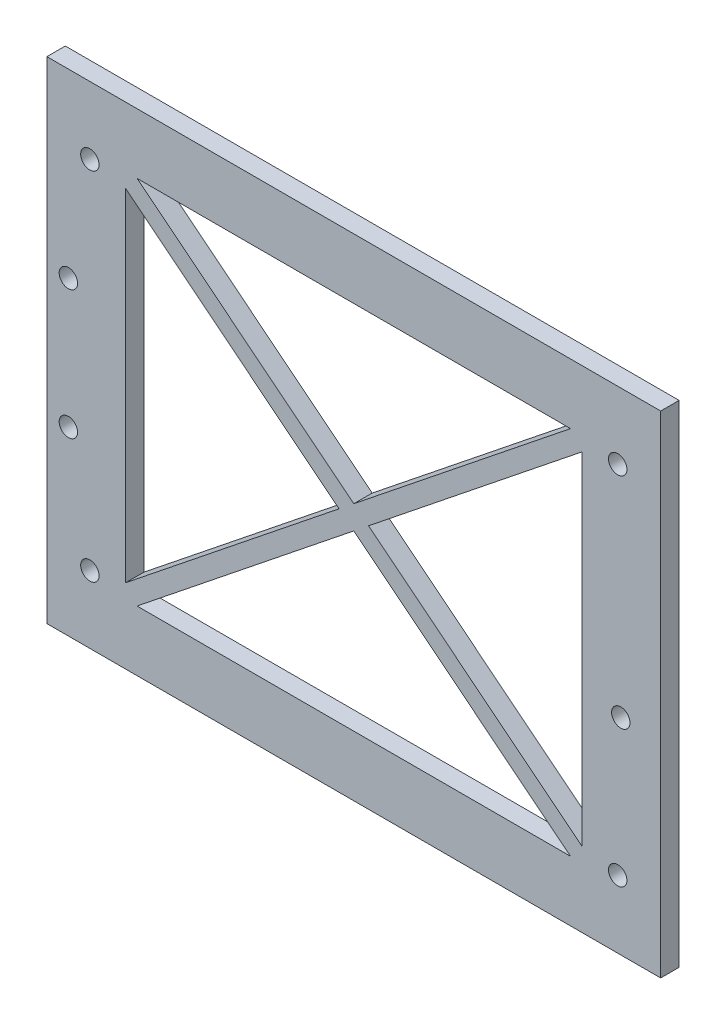
ISO-10303-21;
HEADER;
FILE_DESCRIPTION(('STEP AP214'),'2;1');
FILE_NAME('part.step','',(''),(''),'','','');
FILE_SCHEMA(('AUTOMOTIVE_DESIGN { 1 0 10303 214 1 1 1 1 }'));
ENDSEC;
DATA;
#1=APPLICATION_CONTEXT('core data for automotive mechanical design processes');
#2=APPLICATION_PROTOCOL_DEFINITION('international standard','automotive_design',2000,#1);
#3=PRODUCT_CONTEXT('',#1,'mechanical');
#4=PRODUCT('Part','Part','',(#3));
#5=PRODUCT_RELATED_PRODUCT_CATEGORY('part','',(#4));
#6=PRODUCT_DEFINITION_FORMATION('','',#4);
#7=PRODUCT_DEFINITION_CONTEXT('part definition',#1,'design');
#8=PRODUCT_DEFINITION('design','',#6,#7);
#9=PRODUCT_DEFINITION_SHAPE('','',#8);
#10=(LENGTH_UNIT() NAMED_UNIT(*) SI_UNIT(.MILLI.,.METRE.));
#11=(NAMED_UNIT(*) PLANE_ANGLE_UNIT() SI_UNIT($,.RADIAN.));
#12=(NAMED_UNIT(*) SI_UNIT($,.STERADIAN.) SOLID_ANGLE_UNIT());
#13=UNCERTAINTY_MEASURE_WITH_UNIT(LENGTH_MEASURE(1.E-05),#10,'distance_accuracy_value','');
#14=(GEOMETRIC_REPRESENTATION_CONTEXT(3) GLOBAL_UNCERTAINTY_ASSIGNED_CONTEXT((#13)) GLOBAL_UNIT_ASSIGNED_CONTEXT((#10,
#11,#12)) REPRESENTATION_CONTEXT('',''));
#15=CARTESIAN_POINT('',(0.,0.,0.));
#16=DIRECTION('',(0.,0.,1.));
#17=DIRECTION('',(1.,0.,0.));
#18=AXIS2_PLACEMENT_3D('',#15,#16,#17);
#19=CARTESIAN_POINT('',(2.4011715890373,0.,3.));
#20=DIRECTION('',(-0.624695047554424,0.78086880944303,0.));
#21=DIRECTION('',(-0.780868809443031,-0.624695047554424,0.));
#22=AXIS2_PLACEMENT_3D('',#19,#20,#21);
#23=PLANE('',#22);
#24=DIRECTION('',(0.780868809443031,0.624695047554424,0.));
#25=VECTOR('',#24,1.);
#26=CARTESIAN_POINT('',(2.4011715890373,0.,0.));
#27=LINE('',#26,#25);
#28=CARTESIAN_POINT('',(2.4011715890373,0.,0.));
#29=VERTEX_POINT('',#28);
#30=CARTESIAN_POINT('',(37.1870425713316,27.8286967858354,0.));
#31=VERTEX_POINT('',#30);
#32=EDGE_CURVE('E183',#29,#31,#27,.T.);
#33=ORIENTED_EDGE('',*,*,#32,.T.);
#34=DIRECTION('',(0.,0.,-1.));
#35=VECTOR('',#34,1.);
#36=CARTESIAN_POINT('',(37.1870425713316,27.8286967858355,3.));
#37=LINE('',#36,#35);
#38=CARTESIAN_POINT('',(37.1870425713316,27.8286967858354,3.));
#39=VERTEX_POINT('',#38);
#40=EDGE_CURVE('E11',#39,#31,#37,.T.);
#41=ORIENTED_EDGE('',*,*,#40,.F.);
#42=DIRECTION('',(0.780868809443031,0.624695047554424,0.));
#43=VECTOR('',#42,1.);
#44=CARTESIAN_POINT('',(2.4011715890373,0.,3.));
#45=LINE('',#44,#43);
#46=CARTESIAN_POINT('',(2.4011715890373,0.,3.));
#47=VERTEX_POINT('',#46);
#48=EDGE_CURVE('E164',#47,#39,#45,.T.);
#49=ORIENTED_EDGE('',*,*,#48,.F.);
#50=DIRECTION('',(0.,0.,-1.));
#51=VECTOR('',#50,1.);
#52=CARTESIAN_POINT('',(2.4011715890373,0.,3.));
#53=LINE('',#52,#51);
#54=EDGE_CURVE('E55',#47,#29,#53,.T.);
#55=ORIENTED_EDGE('',*,*,#54,.T.);
#56=EDGE_LOOP('',(#33,#41,#49,#55));
#57=FACE_BOUND('',#56,.T.);
#58=ADVANCED_FACE('F39',(#57),#23,.F.);
#59=CARTESIAN_POINT('',(0.,1.92093727122986,3.));
#60=DIRECTION('',(-0.624695047554424,0.78086880944303,0.));
#61=DIRECTION('',(-0.78086880944303,-0.624695047554424,0.));
#62=AXIS2_PLACEMENT_3D('',#59,#60,#61);
#63=PLANE('',#62);
#64=DIRECTION('',(0.78086880944303,0.624695047554424,0.));
#65=VECTOR('',#64,1.);
#66=CARTESIAN_POINT('',(0.,1.92093727122986,0.));
#67=LINE('',#66,#65);
#68=CARTESIAN_POINT('',(0.,1.92093727122986,0.));
#69=VERTEX_POINT('',#68);
#70=CARTESIAN_POINT('',(35.3129574286684,30.1713032141645,0.));
#71=VERTEX_POINT('',#70);
#72=EDGE_CURVE('E185',#69,#71,#67,.T.);
#73=ORIENTED_EDGE('',*,*,#72,.F.);
#74=DIRECTION('',(0.,0.,-1.));
#75=VECTOR('',#74,1.);
#76=CARTESIAN_POINT('',(0.,1.92093727122986,3.));
#77=LINE('',#76,#75);
#78=CARTESIAN_POINT('',(0.,1.92093727122986,3.));
#79=VERTEX_POINT('',#78);
#80=EDGE_CURVE('E96',#79,#69,#77,.T.);
#81=ORIENTED_EDGE('',*,*,#80,.F.);
#82=DIRECTION('',(0.78086880944303,0.624695047554424,0.));
#83=VECTOR('',#82,1.);
#84=CARTESIAN_POINT('',(0.,1.92093727122986,3.));
#85=LINE('',#84,#83);
#86=CARTESIAN_POINT('',(35.3129574286684,30.1713032141645,3.));
#87=VERTEX_POINT('',#86);
#88=EDGE_CURVE('E224',#79,#87,#85,.T.);
#89=ORIENTED_EDGE('',*,*,#88,.T.);
#90=DIRECTION('',(0.,0.,-1.));
#91=VECTOR('',#90,1.);
#92=CARTESIAN_POINT('',(35.3129574286684,30.1713032141645,3.));
#93=LINE('',#92,#91);
#94=EDGE_CURVE('E47',#87,#71,#93,.T.);
#95=ORIENTED_EDGE('',*,*,#94,.T.);
#96=EDGE_LOOP('',(#73,#81,#89,#95));
#97=FACE_BOUND('',#96,.T.);
#98=ADVANCED_FACE('F223',(#97),#63,.T.);
#99=CARTESIAN_POINT('',(-35.3129574286683,30.1713032141645,3.));
#100=DIRECTION('',(0.624695047554424,0.78086880944303,0.));
#101=DIRECTION('',(-0.78086880944303,0.624695047554424,0.));
#102=AXIS2_PLACEMENT_3D('',#99,#100,#101);
#103=PLANE('',#102);
#104=DIRECTION('',(0.78086880944303,-0.624695047554424,0.));
#105=VECTOR('',#104,1.);
#106=CARTESIAN_POINT('',(-35.3129574286683,30.1713032141645,0.));
#107=LINE('',#106,#105);
#108=CARTESIAN_POINT('',(-35.3129574286683,30.1713032141645,0.));
#109=VERTEX_POINT('',#108);
#110=EDGE_CURVE('E189',#109,#69,#107,.T.);
#111=ORIENTED_EDGE('',*,*,#110,.F.);
#112=DIRECTION('',(0.,0.,-1.));
#113=VECTOR('',#112,1.);
#114=CARTESIAN_POINT('',(-35.3129574286684,30.1713032141645,3.));
#115=LINE('',#114,#113);
#116=CARTESIAN_POINT('',(-35.3129574286683,30.1713032141645,3.));
#117=VERTEX_POINT('',#116);
#118=EDGE_CURVE('E219',#117,#109,#115,.T.);
#119=ORIENTED_EDGE('',*,*,#118,.F.);
#120=DIRECTION('',(0.78086880944303,-0.624695047554424,0.));
#121=VECTOR('',#120,1.);
#122=CARTESIAN_POINT('',(-35.3129574286683,30.1713032141645,3.));
#123=LINE('',#122,#121);
#124=EDGE_CURVE('E237',#117,#79,#123,.T.);
#125=ORIENTED_EDGE('',*,*,#124,.T.);
#126=ORIENTED_EDGE('',*,*,#80,.T.);
#127=EDGE_LOOP('',(#111,#119,#125,#126));
#128=FACE_BOUND('',#127,.T.);
#129=ADVANCED_FACE('F234',(#128),#103,.T.);
#130=CARTESIAN_POINT('',(-37.1870425713316,27.8286967858354,3.));
#131=DIRECTION('',(0.624695047554424,0.78086880944303,0.));
#132=DIRECTION('',(-0.78086880944303,0.624695047554424,0.));
#133=AXIS2_PLACEMENT_3D('',#130,#131,#132);
#134=PLANE('',#133);
#135=DIRECTION('',(0.78086880944303,-0.624695047554424,0.));
#136=VECTOR('',#135,1.);
#137=CARTESIAN_POINT('',(-37.1870425713316,27.8286967858354,0.));
#138=LINE('',#137,#136);
#139=CARTESIAN_POINT('',(-37.1870425713316,27.8286967858354,0.));
#140=VERTEX_POINT('',#139);
#141=CARTESIAN_POINT('',(-2.40117158903732,0.,0.));
#142=VERTEX_POINT('',#141);
#143=EDGE_CURVE('E192',#140,#142,#138,.T.);
#144=ORIENTED_EDGE('',*,*,#143,.T.);
#145=DIRECTION('',(0.,0.,-1.));
#146=VECTOR('',#145,1.);
#147=CARTESIAN_POINT('',(-2.40117158903732,0.,3.));
#148=LINE('',#147,#146);
#149=CARTESIAN_POINT('',(-2.40117158903732,0.,3.));
#150=VERTEX_POINT('',#149);
#151=EDGE_CURVE('E214',#150,#142,#148,.T.);
#152=ORIENTED_EDGE('',*,*,#151,.F.);
#153=DIRECTION('',(0.78086880944303,-0.624695047554424,0.));
#154=VECTOR('',#153,1.);
#155=CARTESIAN_POINT('',(-37.1870425713316,27.8286967858354,3.));
#156=LINE('',#155,#154);
#157=CARTESIAN_POINT('',(-37.1870425713316,27.8286967858354,3.));
#158=VERTEX_POINT('',#157);
#159=EDGE_CURVE('E239',#158,#150,#156,.T.);
#160=ORIENTED_EDGE('',*,*,#159,.F.);
#161=DIRECTION('',(0.,0.,-1.));
#162=VECTOR('',#161,1.);
#163=CARTESIAN_POINT('',(-37.1870425713316,27.8286967858354,3.));
#164=LINE('',#163,#162);
#165=EDGE_CURVE('E216',#158,#140,#164,.T.);
#166=ORIENTED_EDGE('',*,*,#165,.T.);
#167=EDGE_LOOP('',(#144,#152,#160,#166));
#168=FACE_BOUND('',#167,.T.);
#169=ADVANCED_FACE('F436',(#168),#134,.F.);
#170=CARTESIAN_POINT('',(-37.1870425713316,-27.8286967858354,3.));
#171=DIRECTION('',(-0.624695047554424,0.78086880944303,0.));
#172=DIRECTION('',(-0.78086880944303,-0.624695047554424,0.));
#173=AXIS2_PLACEMENT_3D('',#170,#171,#172);
#174=PLANE('',#173);
#175=DIRECTION('',(0.78086880944303,0.624695047554424,0.));
#176=VECTOR('',#175,1.);
#177=CARTESIAN_POINT('',(-37.1870425713316,-27.8286967858354,0.));
#178=LINE('',#177,#176);
#179=CARTESIAN_POINT('',(-37.1870425713316,-27.8286967858354,0.));
#180=VERTEX_POINT('',#179);
#181=EDGE_CURVE('E195',#180,#142,#178,.T.);
#182=ORIENTED_EDGE('',*,*,#181,.F.);
#183=DIRECTION('',(0.,0.,-1.));
#184=VECTOR('',#183,1.);
#185=CARTESIAN_POINT('',(-37.1870425713316,-27.8286967858354,3.));
#186=LINE('',#185,#184);
#187=CARTESIAN_POINT('',(-37.1870425713316,-27.8286967858354,3.));
#188=VERTEX_POINT('',#187);
#189=EDGE_CURVE('E212',#188,#180,#186,.T.);
#190=ORIENTED_EDGE('',*,*,#189,.F.);
#191=DIRECTION('',(0.78086880944303,0.624695047554424,0.));
#192=VECTOR('',#191,1.);
#193=CARTESIAN_POINT('',(-37.1870425713316,-27.8286967858354,3.));
#194=LINE('',#193,#192);
#195=EDGE_CURVE('E241',#188,#150,#194,.T.);
#196=ORIENTED_EDGE('',*,*,#195,.T.);
#197=ORIENTED_EDGE('',*,*,#151,.T.);
#198=EDGE_LOOP('',(#182,#190,#196,#197));
#199=FACE_BOUND('',#198,.T.);
#200=ADVANCED_FACE('F433',(#199),#174,.T.);
#201=CARTESIAN_POINT('',(-35.3129574286683,-30.1713032141645,3.));
#202=DIRECTION('',(-0.624695047554424,0.78086880944303,0.));
#203=DIRECTION('',(-0.78086880944303,-0.624695047554424,0.));
#204=AXIS2_PLACEMENT_3D('',#201,#202,#203);
#205=PLANE('',#204);
#206=DIRECTION('',(0.78086880944303,0.624695047554424,0.));
#207=VECTOR('',#206,1.);
#208=CARTESIAN_POINT('',(-35.3129574286683,-30.1713032141645,0.));
#209=LINE('',#208,#207);
#210=CARTESIAN_POINT('',(-35.3129574286683,-30.1713032141645,0.));
#211=VERTEX_POINT('',#210);
#212=CARTESIAN_POINT('',(0.,-1.92093727122987,0.));
#213=VERTEX_POINT('',#212);
#214=EDGE_CURVE('E198',#211,#213,#209,.T.);
#215=ORIENTED_EDGE('',*,*,#214,.T.);
#216=DIRECTION('',(0.,0.,-1.));
#217=VECTOR('',#216,1.);
#218=CARTESIAN_POINT('',(0.,-1.92093727122987,3.));
#219=LINE('',#218,#217);
#220=CARTESIAN_POINT('',(0.,-1.92093727122987,3.));
#221=VERTEX_POINT('',#220);
#222=EDGE_CURVE('E206',#221,#213,#219,.T.);
#223=ORIENTED_EDGE('',*,*,#222,.F.);
#224=DIRECTION('',(0.78086880944303,0.624695047554424,0.));
#225=VECTOR('',#224,1.);
#226=CARTESIAN_POINT('',(-35.3129574286683,-30.1713032141645,3.));
#227=LINE('',#226,#225);
#228=CARTESIAN_POINT('',(-35.3129574286683,-30.1713032141645,3.));
#229=VERTEX_POINT('',#228);
#230=EDGE_CURVE('E179',#229,#221,#227,.T.);
#231=ORIENTED_EDGE('',*,*,#230,.F.);
#232=DIRECTION('',(0.,0.,-1.));
#233=VECTOR('',#232,1.);
#234=CARTESIAN_POINT('',(-35.3129574286683,-30.1713032141645,3.));
#235=LINE('',#234,#233);
#236=EDGE_CURVE('E209',#229,#211,#235,.T.);
#237=ORIENTED_EDGE('',*,*,#236,.T.);
#238=EDGE_LOOP('',(#215,#223,#231,#237));
#239=FACE_BOUND('',#238,.T.);
#240=ADVANCED_FACE('F255',(#239),#205,.F.);
#241=CARTESIAN_POINT('',(0.,-1.92093727122987,3.));
#242=DIRECTION('',(0.624695047554423,0.780868809443031,0.));
#243=DIRECTION('',(-0.780868809443031,0.624695047554423,0.));
#244=AXIS2_PLACEMENT_3D('',#241,#242,#243);
#245=PLANE('',#244);
#246=DIRECTION('',(0.780868809443031,-0.624695047554423,0.));
#247=VECTOR('',#246,1.);
#248=CARTESIAN_POINT('',(0.,-1.92093727122987,0.));
#249=LINE('',#248,#247);
#250=CARTESIAN_POINT('',(35.3129574286684,-30.1713032141645,0.));
#251=VERTEX_POINT('',#250);
#252=EDGE_CURVE('E200',#213,#251,#249,.T.);
#253=ORIENTED_EDGE('',*,*,#252,.T.);
#254=DIRECTION('',(0.,0.,-1.));
#255=VECTOR('',#254,1.);
#256=CARTESIAN_POINT('',(35.3129574286684,-30.1713032141645,3.));
#257=LINE('',#256,#255);
#258=CARTESIAN_POINT('',(35.3129574286684,-30.1713032141645,3.));
#259=VERTEX_POINT('',#258);
#260=EDGE_CURVE('E172',#259,#251,#257,.T.);
#261=ORIENTED_EDGE('',*,*,#260,.F.);
#262=DIRECTION('',(0.780868809443031,-0.624695047554423,0.));
#263=VECTOR('',#262,1.);
#264=CARTESIAN_POINT('',(0.,-1.92093727122987,3.));
#265=LINE('',#264,#263);
#266=EDGE_CURVE('E175',#221,#259,#265,.T.);
#267=ORIENTED_EDGE('',*,*,#266,.F.);
#268=ORIENTED_EDGE('',*,*,#222,.T.);
#269=EDGE_LOOP('',(#253,#261,#267,#268));
#270=FACE_BOUND('',#269,.T.);
#271=ADVANCED_FACE('F259',(#270),#245,.F.);
#272=CARTESIAN_POINT('',(2.4011715890373,0.,3.));
#273=DIRECTION('',(0.624695047554423,0.780868809443031,0.));
#274=DIRECTION('',(-0.780868809443031,0.624695047554423,0.));
#275=AXIS2_PLACEMENT_3D('',#272,#273,#274);
#276=PLANE('',#275);
#277=DIRECTION('',(0.780868809443031,-0.624695047554423,0.));
#278=VECTOR('',#277,1.);
#279=CARTESIAN_POINT('',(2.4011715890373,0.,0.));
#280=LINE('',#279,#278);
#281=CARTESIAN_POINT('',(37.1870425713317,-27.8286967858354,0.));
#282=VERTEX_POINT('',#281);
#283=EDGE_CURVE('E203',#29,#282,#280,.T.);
#284=ORIENTED_EDGE('',*,*,#283,.F.);
#285=ORIENTED_EDGE('',*,*,#54,.F.);
#286=DIRECTION('',(0.780868809443031,-0.624695047554423,0.));
#287=VECTOR('',#286,1.);
#288=CARTESIAN_POINT('',(2.4011715890373,0.,3.));
#289=LINE('',#288,#287);
#290=CARTESIAN_POINT('',(37.1870425713317,-27.8286967858354,3.));
#291=VERTEX_POINT('',#290);
#292=EDGE_CURVE('E163',#47,#291,#289,.T.);
#293=ORIENTED_EDGE('',*,*,#292,.T.);
#294=DIRECTION('',(0.,0.,-1.));
#295=VECTOR('',#294,1.);
#296=CARTESIAN_POINT('',(37.1870425713317,-27.8286967858354,3.));
#297=LINE('',#296,#295);
#298=EDGE_CURVE('E169',#291,#282,#297,.T.);
#299=ORIENTED_EDGE('',*,*,#298,.T.);
#300=EDGE_LOOP('',(#284,#285,#293,#299));
#301=FACE_BOUND('',#300,.T.);
#302=ADVANCED_FACE('F174',(#301),#276,.T.);
#303=CARTESIAN_POINT('',(36.25,29.,3.));
#304=DIRECTION('',(0.,0.,1.));
#305=DIRECTION('',(1.,0.,0.));
#306=AXIS2_PLACEMENT_3D('',#303,#304,#305);
#307=PLANE('',#306);
#308=DIRECTION('',(1.,0.,0.));
#309=VECTOR('',#308,1.);
#310=CARTESIAN_POINT('',(0.,30.1713032141645,3.));
#311=LINE('',#310,#309);
#312=EDGE_CURVE('E166',#117,#87,#311,.T.);
#313=ORIENTED_EDGE('',*,*,#312,.T.);
#314=ORIENTED_EDGE('',*,*,#88,.F.);
#315=ORIENTED_EDGE('',*,*,#124,.F.);
#316=EDGE_LOOP('',(#313,#314,#315));
#317=FACE_BOUND('',#316,.T.);
#318=DIRECTION('',(0.,-1.,0.));
#319=VECTOR('',#318,1.);
#320=CARTESIAN_POINT('',(-37.1870425713316,0.,3.));
#321=LINE('',#320,#319);
#322=EDGE_CURVE('E358',#158,#188,#321,.T.);
#323=ORIENTED_EDGE('',*,*,#322,.F.);
#324=ORIENTED_EDGE('',*,*,#159,.T.);
#325=ORIENTED_EDGE('',*,*,#195,.F.);
#326=EDGE_LOOP('',(#323,#324,#325));
#327=FACE_BOUND('',#326,.T.);
#328=DIRECTION('',(1.,0.,0.));
#329=VECTOR('',#328,1.);
#330=CARTESIAN_POINT('',(0.,-30.1713032141645,3.));
#331=LINE('',#330,#329);
#332=EDGE_CURVE('E253',#229,#259,#331,.T.);
#333=ORIENTED_EDGE('',*,*,#332,.F.);
#334=ORIENTED_EDGE('',*,*,#230,.T.);
#335=ORIENTED_EDGE('',*,*,#266,.T.);
#336=EDGE_LOOP('',(#333,#334,#335));
#337=FACE_BOUND('',#336,.T.);
#338=ORIENTED_EDGE('',*,*,#48,.T.);
#339=DIRECTION('',(0.,-1.,0.));
#340=VECTOR('',#339,1.);
#341=CARTESIAN_POINT('',(37.1870425713316,0.,3.));
#342=LINE('',#341,#340);
#343=EDGE_CURVE('E160',#39,#291,#342,.T.);
#344=ORIENTED_EDGE('',*,*,#343,.T.);
#345=ORIENTED_EDGE('',*,*,#292,.F.);
#346=EDGE_LOOP('',(#338,#344,#345));
#347=FACE_BOUND('',#346,.T.);
#348=CARTESIAN_POINT('',(-43.,-29.,3.));
#349=DIRECTION('',(0.,0.,1.));
#350=DIRECTION('',(1.,0.,0.));
#351=AXIS2_PLACEMENT_3D('',#348,#349,#350);
#352=CIRCLE('',#351,1.50000000000001);
#353=CARTESIAN_POINT('',(-41.5,-29.,3.));
#354=VERTEX_POINT('',#353);
#355=EDGE_CURVE('E284',#354,#354,#352,.F.);
#356=ORIENTED_EDGE('',*,*,#355,.T.);
#357=EDGE_LOOP('',(#356));
#358=FACE_BOUND('',#357,.T.);
#359=CARTESIAN_POINT('',(43.,-29.,3.));
#360=DIRECTION('',(0.,0.,1.));
#361=DIRECTION('',(1.,0.,0.));
#362=AXIS2_PLACEMENT_3D('',#359,#360,#361);
#363=CIRCLE('',#362,1.5);
#364=CARTESIAN_POINT('',(44.5,-29.,3.));
#365=VERTEX_POINT('',#364);
#366=EDGE_CURVE('E331',#365,#365,#363,.T.);
#367=ORIENTED_EDGE('',*,*,#366,.F.);
#368=EDGE_LOOP('',(#367));
#369=FACE_BOUND('',#368,.T.);
#370=CARTESIAN_POINT('',(-46.5,10.5,3.));
#371=DIRECTION('',(0.,0.,1.));
#372=DIRECTION('',(1.,0.,0.));
#373=AXIS2_PLACEMENT_3D('',#370,#371,#372);
#374=CIRCLE('',#373,1.5);
#375=CARTESIAN_POINT('',(-45.,10.5,3.));
#376=VERTEX_POINT('',#375);
#377=EDGE_CURVE('E334',#376,#376,#374,.T.);
#378=ORIENTED_EDGE('',*,*,#377,.F.);
#379=EDGE_LOOP('',(#378));
#380=FACE_BOUND('',#379,.T.);
#381=DIRECTION('',(0.,1.,0.));
#382=VECTOR('',#381,1.);
#383=CARTESIAN_POINT('',(-50.,0.,3.));
#384=LINE('',#383,#382);
#385=CARTESIAN_POINT('',(-50.,-40.,3.));
#386=VERTEX_POINT('',#385);
#387=CARTESIAN_POINT('',(-50.,40.,3.));
#388=VERTEX_POINT('',#387);
#389=EDGE_CURVE('E344',#386,#388,#384,.T.);
#390=ORIENTED_EDGE('',*,*,#389,.F.);
#391=DIRECTION('',(-1.,0.,0.));
#392=VECTOR('',#391,1.);
#393=CARTESIAN_POINT('',(0.,-40.,3.));
#394=LINE('',#393,#392);
#395=CARTESIAN_POINT('',(50.,-40.,3.));
#396=VERTEX_POINT('',#395);
#397=EDGE_CURVE('E297',#396,#386,#394,.T.);
#398=ORIENTED_EDGE('',*,*,#397,.F.);
#399=DIRECTION('',(0.,1.,0.));
#400=VECTOR('',#399,1.);
#401=CARTESIAN_POINT('',(50.,0.,3.));
#402=LINE('',#401,#400);
#403=CARTESIAN_POINT('',(50.,40.,3.));
#404=VERTEX_POINT('',#403);
#405=EDGE_CURVE('E340',#396,#404,#402,.T.);
#406=ORIENTED_EDGE('',*,*,#405,.T.);
#407=DIRECTION('',(-1.,0.,0.));
#408=VECTOR('',#407,1.);
#409=CARTESIAN_POINT('',(0.,40.,3.));
#410=LINE('',#409,#408);
#411=EDGE_CURVE('E338',#404,#388,#410,.T.);
#412=ORIENTED_EDGE('',*,*,#411,.T.);
#413=EDGE_LOOP('',(#390,#398,#406,#412));
#414=FACE_BOUND('',#413,.T.);
#415=CARTESIAN_POINT('',(43.5,-6.5,3.));
#416=DIRECTION('',(0.,0.,1.));
#417=DIRECTION('',(1.,0.,0.));
#418=AXIS2_PLACEMENT_3D('',#415,#416,#417);
#419=CIRCLE('',#418,1.5);
#420=CARTESIAN_POINT('',(45.,-6.5,3.));
#421=VERTEX_POINT('',#420);
#422=EDGE_CURVE('E346',#421,#421,#419,.T.);
#423=ORIENTED_EDGE('',*,*,#422,.F.);
#424=EDGE_LOOP('',(#423));
#425=FACE_BOUND('',#424,.T.);
#426=CARTESIAN_POINT('',(-43.,29.,3.));
#427=DIRECTION('',(0.,0.,1.));
#428=DIRECTION('',(1.,0.,0.));
#429=AXIS2_PLACEMENT_3D('',#426,#427,#428);
#430=CIRCLE('',#429,1.5);
#431=CARTESIAN_POINT('',(-41.5,29.,3.));
#432=VERTEX_POINT('',#431);
#433=EDGE_CURVE('E349',#432,#432,#430,.T.);
#434=ORIENTED_EDGE('',*,*,#433,.F.);
#435=EDGE_LOOP('',(#434));
#436=FACE_BOUND('',#435,.T.);
#437=CARTESIAN_POINT('',(43.,29.,3.));
#438=DIRECTION('',(0.,0.,1.));
#439=DIRECTION('',(1.,0.,0.));
#440=AXIS2_PLACEMENT_3D('',#437,#438,#439);
#441=CIRCLE('',#440,1.5);
#442=CARTESIAN_POINT('',(44.5,29.,3.));
#443=VERTEX_POINT('',#442);
#444=EDGE_CURVE('E352',#443,#443,#441,.F.);
#445=ORIENTED_EDGE('',*,*,#444,.T.);
#446=EDGE_LOOP('',(#445));
#447=FACE_BOUND('',#446,.T.);
#448=CARTESIAN_POINT('',(-46.5,-10.5,3.));
#449=DIRECTION('',(0.,0.,1.));
#450=DIRECTION('',(1.,0.,0.));
#451=AXIS2_PLACEMENT_3D('',#448,#449,#450);
#452=CIRCLE('',#451,1.5);
#453=CARTESIAN_POINT('',(-45.,-10.5,3.));
#454=VERTEX_POINT('',#453);
#455=EDGE_CURVE('E355',#454,#454,#452,.F.);
#456=ORIENTED_EDGE('',*,*,#455,.T.);
#457=EDGE_LOOP('',(#456));
#458=FACE_BOUND('',#457,.T.);
#459=ADVANCED_FACE('F161',(#317,#327,#337,#347,#358,#369,#380,#414,#425,#436,#447,#458),#307,.T.);
#460=CARTESIAN_POINT('',(36.25,29.,0.));
#461=DIRECTION('',(0.,0.,1.));
#462=DIRECTION('',(1.,0.,0.));
#463=AXIS2_PLACEMENT_3D('',#460,#461,#462);
#464=PLANE('',#463);
#465=ORIENTED_EDGE('',*,*,#72,.T.);
#466=DIRECTION('',(1.,0.,0.));
#467=VECTOR('',#466,1.);
#468=CARTESIAN_POINT('',(0.,30.1713032141645,0.));
#469=LINE('',#468,#467);
#470=EDGE_CURVE('E230',#109,#71,#469,.T.);
#471=ORIENTED_EDGE('',*,*,#470,.F.);
#472=ORIENTED_EDGE('',*,*,#110,.T.);
#473=EDGE_LOOP('',(#465,#471,#472));
#474=FACE_BOUND('',#473,.T.);
#475=ORIENTED_EDGE('',*,*,#143,.F.);
#476=DIRECTION('',(0.,-1.,0.));
#477=VECTOR('',#476,1.);
#478=CARTESIAN_POINT('',(-37.1870425713316,0.,0.));
#479=LINE('',#478,#477);
#480=EDGE_CURVE('E324',#140,#180,#479,.T.);
#481=ORIENTED_EDGE('',*,*,#480,.T.);
#482=ORIENTED_EDGE('',*,*,#181,.T.);
#483=EDGE_LOOP('',(#475,#481,#482));
#484=FACE_BOUND('',#483,.T.);
#485=ORIENTED_EDGE('',*,*,#214,.F.);
#486=DIRECTION('',(1.,0.,0.));
#487=VECTOR('',#486,1.);
#488=CARTESIAN_POINT('',(0.,-30.1713032141645,0.));
#489=LINE('',#488,#487);
#490=EDGE_CURVE('E263',#211,#251,#489,.T.);
#491=ORIENTED_EDGE('',*,*,#490,.T.);
#492=ORIENTED_EDGE('',*,*,#252,.F.);
#493=EDGE_LOOP('',(#485,#491,#492));
#494=FACE_BOUND('',#493,.T.);
#495=ORIENTED_EDGE('',*,*,#32,.F.);
#496=ORIENTED_EDGE('',*,*,#283,.T.);
#497=DIRECTION('',(0.,-1.,0.));
#498=VECTOR('',#497,1.);
#499=CARTESIAN_POINT('',(37.1870425713316,0.,0.));
#500=LINE('',#499,#498);
#501=EDGE_CURVE('E85',#31,#282,#500,.T.);
#502=ORIENTED_EDGE('',*,*,#501,.F.);
#503=EDGE_LOOP('',(#495,#496,#502));
#504=FACE_BOUND('',#503,.T.);
#505=CARTESIAN_POINT('',(-46.5,-10.5,0.));
#506=DIRECTION('',(0.,0.,1.));
#507=DIRECTION('',(1.,0.,0.));
#508=AXIS2_PLACEMENT_3D('',#505,#506,#507);
#509=CIRCLE('',#508,1.5);
#510=CARTESIAN_POINT('',(-45.,-10.5,0.));
#511=VERTEX_POINT('',#510);
#512=EDGE_CURVE('E321',#511,#511,#509,.F.);
#513=ORIENTED_EDGE('',*,*,#512,.F.);
#514=EDGE_LOOP('',(#513));
#515=FACE_BOUND('',#514,.T.);
#516=CARTESIAN_POINT('',(43.,29.,0.));
#517=DIRECTION('',(0.,0.,1.));
#518=DIRECTION('',(1.,0.,0.));
#519=AXIS2_PLACEMENT_3D('',#516,#517,#518);
#520=CIRCLE('',#519,1.5);
#521=CARTESIAN_POINT('',(44.5,29.,0.));
#522=VERTEX_POINT('',#521);
#523=EDGE_CURVE('E318',#522,#522,#520,.F.);
#524=ORIENTED_EDGE('',*,*,#523,.F.);
#525=EDGE_LOOP('',(#524));
#526=FACE_BOUND('',#525,.T.);
#527=CARTESIAN_POINT('',(-43.,29.,0.));
#528=DIRECTION('',(0.,0.,1.));
#529=DIRECTION('',(1.,0.,0.));
#530=AXIS2_PLACEMENT_3D('',#527,#528,#529);
#531=CIRCLE('',#530,1.5);
#532=CARTESIAN_POINT('',(-41.5,29.,0.));
#533=VERTEX_POINT('',#532);
#534=EDGE_CURVE('E315',#533,#533,#531,.T.);
#535=ORIENTED_EDGE('',*,*,#534,.T.);
#536=EDGE_LOOP('',(#535));
#537=FACE_BOUND('',#536,.T.);
#538=CARTESIAN_POINT('',(43.5,-6.5,0.));
#539=DIRECTION('',(0.,0.,1.));
#540=DIRECTION('',(1.,0.,0.));
#541=AXIS2_PLACEMENT_3D('',#538,#539,#540);
#542=CIRCLE('',#541,1.5);
#543=CARTESIAN_POINT('',(45.,-6.5,0.));
#544=VERTEX_POINT('',#543);
#545=EDGE_CURVE('E306',#544,#544,#542,.T.);
#546=ORIENTED_EDGE('',*,*,#545,.T.);
#547=EDGE_LOOP('',(#546));
#548=FACE_BOUND('',#547,.T.);
#549=DIRECTION('',(0.,1.,0.));
#550=VECTOR('',#549,1.);
#551=CARTESIAN_POINT('',(-50.,0.,0.));
#552=LINE('',#551,#550);
#553=CARTESIAN_POINT('',(-50.,-40.,0.));
#554=VERTEX_POINT('',#553);
#555=CARTESIAN_POINT('',(-50.,40.,0.));
#556=VERTEX_POINT('',#555);
#557=EDGE_CURVE('E302',#554,#556,#552,.T.);
#558=ORIENTED_EDGE('',*,*,#557,.T.);
#559=DIRECTION('',(-1.,0.,0.));
#560=VECTOR('',#559,1.);
#561=CARTESIAN_POINT('',(0.,40.,0.));
#562=LINE('',#561,#560);
#563=CARTESIAN_POINT('',(50.,40.,0.));
#564=VERTEX_POINT('',#563);
#565=EDGE_CURVE('E267',#564,#556,#562,.T.);
#566=ORIENTED_EDGE('',*,*,#565,.F.);
#567=DIRECTION('',(0.,1.,0.));
#568=VECTOR('',#567,1.);
#569=CARTESIAN_POINT('',(50.,0.,0.));
#570=LINE('',#569,#568);
#571=CARTESIAN_POINT('',(50.,-40.,0.));
#572=VERTEX_POINT('',#571);
#573=EDGE_CURVE('E273',#572,#564,#570,.T.);
#574=ORIENTED_EDGE('',*,*,#573,.F.);
#575=DIRECTION('',(-1.,0.,0.));
#576=VECTOR('',#575,1.);
#577=CARTESIAN_POINT('',(0.,-40.,0.));
#578=LINE('',#577,#576);
#579=EDGE_CURVE('E295',#572,#554,#578,.T.);
#580=ORIENTED_EDGE('',*,*,#579,.T.);
#581=EDGE_LOOP('',(#558,#566,#574,#580));
#582=FACE_BOUND('',#581,.T.);
#583=CARTESIAN_POINT('',(-46.5,10.5,0.));
#584=DIRECTION('',(0.,0.,1.));
#585=DIRECTION('',(1.,0.,0.));
#586=AXIS2_PLACEMENT_3D('',#583,#584,#585);
#587=CIRCLE('',#586,1.5);
#588=CARTESIAN_POINT('',(-45.,10.5,0.));
#589=VERTEX_POINT('',#588);
#590=EDGE_CURVE('E266',#589,#589,#587,.T.);
#591=ORIENTED_EDGE('',*,*,#590,.T.);
#592=EDGE_LOOP('',(#591));
#593=FACE_BOUND('',#592,.T.);
#594=CARTESIAN_POINT('',(43.,-29.,0.));
#595=DIRECTION('',(0.,0.,1.));
#596=DIRECTION('',(1.,0.,0.));
#597=AXIS2_PLACEMENT_3D('',#594,#595,#596);
#598=CIRCLE('',#597,1.5);
#599=CARTESIAN_POINT('',(44.5,-29.,0.));
#600=VERTEX_POINT('',#599);
#601=EDGE_CURVE('E270',#600,#600,#598,.T.);
#602=ORIENTED_EDGE('',*,*,#601,.T.);
#603=EDGE_LOOP('',(#602));
#604=FACE_BOUND('',#603,.T.);
#605=CARTESIAN_POINT('',(-43.,-29.,0.));
#606=DIRECTION('',(0.,0.,1.));
#607=DIRECTION('',(1.,0.,0.));
#608=AXIS2_PLACEMENT_3D('',#605,#606,#607);
#609=CIRCLE('',#608,1.50000000000001);
#610=CARTESIAN_POINT('',(-41.5,-29.,0.));
#611=VERTEX_POINT('',#610);
#612=EDGE_CURVE('E167',#611,#611,#609,.F.);
#613=ORIENTED_EDGE('',*,*,#612,.F.);
#614=EDGE_LOOP('',(#613));
#615=FACE_BOUND('',#614,.T.);
#616=ADVANCED_FACE('F228',(#474,#484,#494,#504,#515,#526,#537,#548,#582,#593,#604,#615),#464,.F.);
#617=CARTESIAN_POINT('',(-50.,0.,3.));
#618=DIRECTION('',(-1.,0.,0.));
#619=DIRECTION('',(0.,0.,1.));
#620=AXIS2_PLACEMENT_3D('',#617,#618,#619);
#621=PLANE('',#620);
#622=ORIENTED_EDGE('',*,*,#557,.F.);
#623=DIRECTION('',(0.,0.,-1.));
#624=VECTOR('',#623,1.);
#625=CARTESIAN_POINT('',(-50.,-40.,3.));
#626=LINE('',#625,#624);
#627=EDGE_CURVE('E186',#386,#554,#626,.T.);
#628=ORIENTED_EDGE('',*,*,#627,.F.);
#629=ORIENTED_EDGE('',*,*,#389,.T.);
#630=DIRECTION('',(0.,0.,-1.));
#631=VECTOR('',#630,1.);
#632=CARTESIAN_POINT('',(-50.,40.,3.));
#633=LINE('',#632,#631);
#634=EDGE_CURVE('E281',#388,#556,#633,.T.);
#635=ORIENTED_EDGE('',*,*,#634,.T.);
#636=EDGE_LOOP('',(#622,#628,#629,#635));
#637=FACE_BOUND('',#636,.T.);
#638=ADVANCED_FACE('F303',(#637),#621,.T.);
#639=CARTESIAN_POINT('',(0.,-40.,3.));
#640=DIRECTION('',(0.,-1.,0.));
#641=DIRECTION('',(1.,0.,0.));
#642=AXIS2_PLACEMENT_3D('',#639,#640,#641);
#643=PLANE('',#642);
#644=ORIENTED_EDGE('',*,*,#579,.F.);
#645=DIRECTION('',(0.,0.,-1.));
#646=VECTOR('',#645,1.);
#647=CARTESIAN_POINT('',(50.,-40.,3.));
#648=LINE('',#647,#646);
#649=EDGE_CURVE('E287',#396,#572,#648,.T.);
#650=ORIENTED_EDGE('',*,*,#649,.F.);
#651=ORIENTED_EDGE('',*,*,#397,.T.);
#652=ORIENTED_EDGE('',*,*,#627,.T.);
#653=EDGE_LOOP('',(#644,#650,#651,#652));
#654=FACE_BOUND('',#653,.T.);
#655=ADVANCED_FACE('F293',(#654),#643,.T.);
#656=CARTESIAN_POINT('',(50.,0.,3.));
#657=DIRECTION('',(-1.,0.,0.));
#658=DIRECTION('',(0.,0.,1.));
#659=AXIS2_PLACEMENT_3D('',#656,#657,#658);
#660=PLANE('',#659);
#661=ORIENTED_EDGE('',*,*,#573,.T.);
#662=DIRECTION('',(0.,0.,-1.));
#663=VECTOR('',#662,1.);
#664=CARTESIAN_POINT('',(50.,40.,3.));
#665=LINE('',#664,#663);
#666=EDGE_CURVE('E283',#404,#564,#665,.T.);
#667=ORIENTED_EDGE('',*,*,#666,.F.);
#668=ORIENTED_EDGE('',*,*,#405,.F.);
#669=ORIENTED_EDGE('',*,*,#649,.T.);
#670=EDGE_LOOP('',(#661,#667,#668,#669));
#671=FACE_BOUND('',#670,.T.);
#672=ADVANCED_FACE('F371',(#671),#660,.F.);
#673=CARTESIAN_POINT('',(-37.1870425713316,0.,3.));
#674=DIRECTION('',(1.,0.,0.));
#675=DIRECTION('',(0.,1.,0.));
#676=AXIS2_PLACEMENT_3D('',#673,#674,#675);
#677=PLANE('',#676);
#678=ORIENTED_EDGE('',*,*,#480,.F.);
#679=ORIENTED_EDGE('',*,*,#165,.F.);
#680=ORIENTED_EDGE('',*,*,#322,.T.);
#681=ORIENTED_EDGE('',*,*,#189,.T.);
#682=EDGE_LOOP('',(#678,#679,#680,#681));
#683=FACE_BOUND('',#682,.T.);
#684=ADVANCED_FACE('F363',(#683),#677,.T.);
#685=CARTESIAN_POINT('',(0.,30.1713032141645,3.));
#686=DIRECTION('',(0.,1.,0.));
#687=DIRECTION('',(-1.,0.,0.));
#688=AXIS2_PLACEMENT_3D('',#685,#686,#687);
#689=PLANE('',#688);
#690=ORIENTED_EDGE('',*,*,#470,.T.);
#691=ORIENTED_EDGE('',*,*,#94,.F.);
#692=ORIENTED_EDGE('',*,*,#312,.F.);
#693=ORIENTED_EDGE('',*,*,#118,.T.);
#694=EDGE_LOOP('',(#690,#691,#692,#693));
#695=FACE_BOUND('',#694,.T.);
#696=ADVANCED_FACE('F361',(#695),#689,.F.);
#697=CARTESIAN_POINT('',(37.1870425713316,0.,3.));
#698=DIRECTION('',(1.,0.,0.));
#699=DIRECTION('',(0.,1.,0.));
#700=AXIS2_PLACEMENT_3D('',#697,#698,#699);
#701=PLANE('',#700);
#702=ORIENTED_EDGE('',*,*,#501,.T.);
#703=ORIENTED_EDGE('',*,*,#298,.F.);
#704=ORIENTED_EDGE('',*,*,#343,.F.);
#705=ORIENTED_EDGE('',*,*,#40,.T.);
#706=EDGE_LOOP('',(#702,#703,#704,#705));
#707=FACE_BOUND('',#706,.T.);
#708=ADVANCED_FACE('F170',(#707),#701,.F.);
#709=CARTESIAN_POINT('',(43.,-29.,3.));
#710=DIRECTION('',(0.,0.,-1.));
#711=DIRECTION('',(-1.,0.,0.));
#712=AXIS2_PLACEMENT_3D('',#709,#710,#711);
#713=CYLINDRICAL_SURFACE('',#712,1.5);
#714=ORIENTED_EDGE('',*,*,#366,.T.);
#715=EDGE_LOOP('',(#714));
#716=FACE_BOUND('',#715,.T.);
#717=ORIENTED_EDGE('',*,*,#601,.F.);
#718=EDGE_LOOP('',(#717));
#719=FACE_BOUND('',#718,.T.);
#720=ADVANCED_FACE('F369',(#716,#719),#713,.F.);
#721=CARTESIAN_POINT('',(-46.5,10.5,3.));
#722=DIRECTION('',(0.,0.,-1.));
#723=DIRECTION('',(-1.,0.,0.));
#724=AXIS2_PLACEMENT_3D('',#721,#722,#723);
#725=CYLINDRICAL_SURFACE('',#724,1.5);
#726=ORIENTED_EDGE('',*,*,#377,.T.);
#727=EDGE_LOOP('',(#726));
#728=FACE_BOUND('',#727,.T.);
#729=ORIENTED_EDGE('',*,*,#590,.F.);
#730=EDGE_LOOP('',(#729));
#731=FACE_BOUND('',#730,.T.);
#732=ADVANCED_FACE('F536',(#728,#731),#725,.F.);
#733=CARTESIAN_POINT('',(0.,-30.1713032141645,3.));
#734=DIRECTION('',(0.,1.,0.));
#735=DIRECTION('',(-1.,0.,0.));
#736=AXIS2_PLACEMENT_3D('',#733,#734,#735);
#737=PLANE('',#736);
#738=ORIENTED_EDGE('',*,*,#490,.F.);
#739=ORIENTED_EDGE('',*,*,#236,.F.);
#740=ORIENTED_EDGE('',*,*,#332,.T.);
#741=ORIENTED_EDGE('',*,*,#260,.T.);
#742=EDGE_LOOP('',(#738,#739,#740,#741));
#743=FACE_BOUND('',#742,.T.);
#744=ADVANCED_FACE('F262',(#743),#737,.T.);
#745=CARTESIAN_POINT('',(0.,40.,3.));
#746=DIRECTION('',(0.,-1.,0.));
#747=DIRECTION('',(1.,0.,0.));
#748=AXIS2_PLACEMENT_3D('',#745,#746,#747);
#749=PLANE('',#748);
#750=ORIENTED_EDGE('',*,*,#565,.T.);
#751=ORIENTED_EDGE('',*,*,#634,.F.);
#752=ORIENTED_EDGE('',*,*,#411,.F.);
#753=ORIENTED_EDGE('',*,*,#666,.T.);
#754=EDGE_LOOP('',(#750,#751,#752,#753));
#755=FACE_BOUND('',#754,.T.);
#756=ADVANCED_FACE('F392',(#755),#749,.F.);
#757=CARTESIAN_POINT('',(43.5,-6.5,3.));
#758=DIRECTION('',(0.,0.,-1.));
#759=DIRECTION('',(-1.,0.,0.));
#760=AXIS2_PLACEMENT_3D('',#757,#758,#759);
#761=CYLINDRICAL_SURFACE('',#760,1.5);
#762=ORIENTED_EDGE('',*,*,#422,.T.);
#763=EDGE_LOOP('',(#762));
#764=FACE_BOUND('',#763,.T.);
#765=ORIENTED_EDGE('',*,*,#545,.F.);
#766=EDGE_LOOP('',(#765));
#767=FACE_BOUND('',#766,.T.);
#768=ADVANCED_FACE('F389',(#764,#767),#761,.F.);
#769=CARTESIAN_POINT('',(-43.,29.,3.));
#770=DIRECTION('',(0.,0.,-1.));
#771=DIRECTION('',(-1.,0.,0.));
#772=AXIS2_PLACEMENT_3D('',#769,#770,#771);
#773=CYLINDRICAL_SURFACE('',#772,1.5);
#774=ORIENTED_EDGE('',*,*,#433,.T.);
#775=EDGE_LOOP('',(#774));
#776=FACE_BOUND('',#775,.T.);
#777=ORIENTED_EDGE('',*,*,#534,.F.);
#778=EDGE_LOOP('',(#777));
#779=FACE_BOUND('',#778,.T.);
#780=ADVANCED_FACE('F391',(#776,#779),#773,.F.);
#781=CARTESIAN_POINT('',(43.,29.,3.));
#782=DIRECTION('',(0.,0.,-1.));
#783=DIRECTION('',(-1.,0.,0.));
#784=AXIS2_PLACEMENT_3D('',#781,#782,#783);
#785=CYLINDRICAL_SURFACE('',#784,1.5);
#786=ORIENTED_EDGE('',*,*,#444,.F.);
#787=EDGE_LOOP('',(#786));
#788=FACE_BOUND('',#787,.T.);
#789=ORIENTED_EDGE('',*,*,#523,.T.);
#790=EDGE_LOOP('',(#789));
#791=FACE_BOUND('',#790,.T.);
#792=ADVANCED_FACE('F399',(#788,#791),#785,.F.);
#793=CARTESIAN_POINT('',(-46.5,-10.5,3.));
#794=DIRECTION('',(0.,0.,-1.));
#795=DIRECTION('',(-1.,0.,0.));
#796=AXIS2_PLACEMENT_3D('',#793,#794,#795);
#797=CYLINDRICAL_SURFACE('',#796,1.5);
#798=ORIENTED_EDGE('',*,*,#455,.F.);
#799=EDGE_LOOP('',(#798));
#800=FACE_BOUND('',#799,.T.);
#801=ORIENTED_EDGE('',*,*,#512,.T.);
#802=EDGE_LOOP('',(#801));
#803=FACE_BOUND('',#802,.T.);
#804=ADVANCED_FACE('F409',(#800,#803),#797,.F.);
#805=CARTESIAN_POINT('',(-43.,-29.,3.));
#806=DIRECTION('',(0.,0.,-1.));
#807=DIRECTION('',(-1.,0.,0.));
#808=AXIS2_PLACEMENT_3D('',#805,#806,#807);
#809=CYLINDRICAL_SURFACE('',#808,1.50000000000001);
#810=ORIENTED_EDGE('',*,*,#355,.F.);
#811=EDGE_LOOP('',(#810));
#812=FACE_BOUND('',#811,.T.);
#813=ORIENTED_EDGE('',*,*,#612,.T.);
#814=EDGE_LOOP('',(#813));
#815=FACE_BOUND('',#814,.T.);
#816=ADVANCED_FACE('F412',(#812,#815),#809,.F.);
#817=CLOSED_SHELL('',(#58,#98,#129,#169,#200,#240,#271,#302,#459,#616,#638,#655,#672,#684,#696,
#708,#720,#732,#744,#756,#768,#780,#792,#804,#816));
#818=MANIFOLD_SOLID_BREP('B2',#817);
#819=ADVANCED_BREP_SHAPE_REPRESENTATION('',(#18,#818),#14);
#820=SHAPE_DEFINITION_REPRESENTATION(#9,#819);
ENDSEC;
END-ISO-10303-21;
